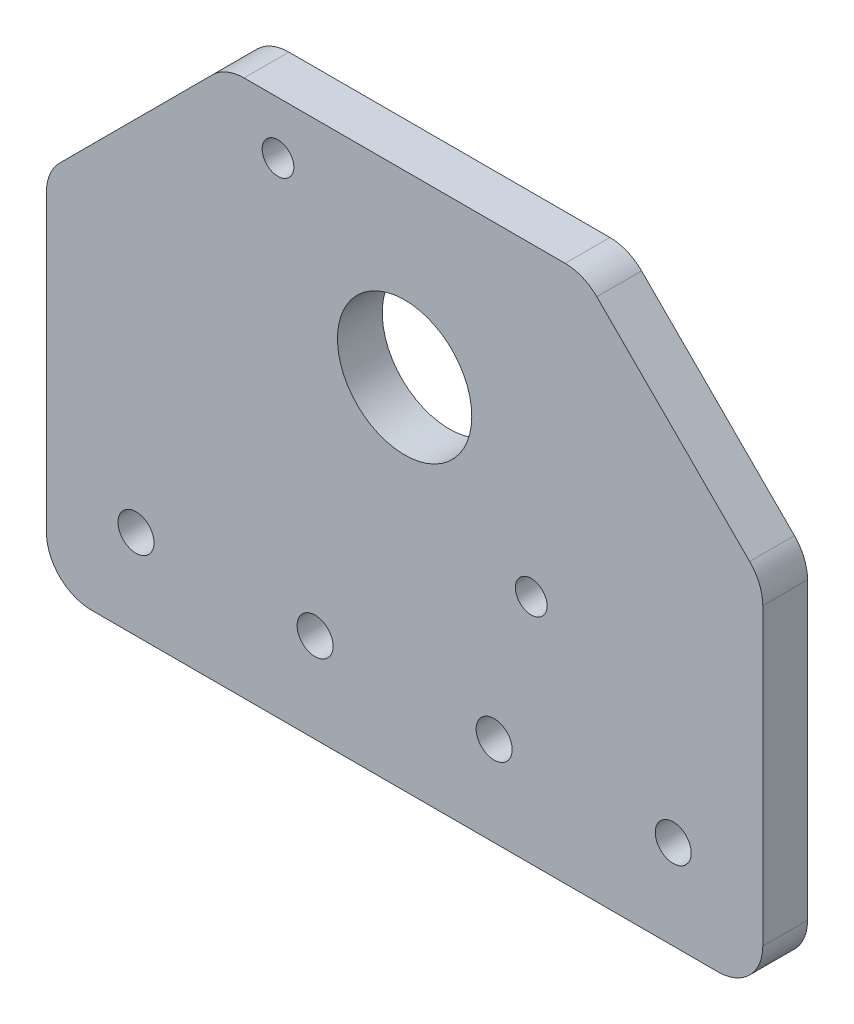
ISO-10303-21;
HEADER;
FILE_DESCRIPTION(('STEP AP214'),'2;1');
FILE_NAME('part.step','',(''),(''),'','','');
FILE_SCHEMA(('AUTOMOTIVE_DESIGN { 1 0 10303 214 1 1 1 1 }'));
ENDSEC;
DATA;
#1=APPLICATION_CONTEXT('core data for automotive mechanical design processes');
#2=APPLICATION_PROTOCOL_DEFINITION('international standard','automotive_design',2000,#1);
#3=PRODUCT_CONTEXT('',#1,'mechanical');
#4=PRODUCT('Part','Part','',(#3));
#5=PRODUCT_RELATED_PRODUCT_CATEGORY('part','',(#4));
#6=PRODUCT_DEFINITION_FORMATION('','',#4);
#7=PRODUCT_DEFINITION_CONTEXT('part definition',#1,'design');
#8=PRODUCT_DEFINITION('design','',#6,#7);
#9=PRODUCT_DEFINITION_SHAPE('','',#8);
#10=(LENGTH_UNIT() NAMED_UNIT(*) SI_UNIT(.MILLI.,.METRE.));
#11=(NAMED_UNIT(*) PLANE_ANGLE_UNIT() SI_UNIT($,.RADIAN.));
#12=(NAMED_UNIT(*) SI_UNIT($,.STERADIAN.) SOLID_ANGLE_UNIT());
#13=UNCERTAINTY_MEASURE_WITH_UNIT(LENGTH_MEASURE(1.E-05),#10,'distance_accuracy_value','');
#14=(GEOMETRIC_REPRESENTATION_CONTEXT(3) GLOBAL_UNCERTAINTY_ASSIGNED_CONTEXT((#13)) GLOBAL_UNIT_ASSIGNED_CONTEXT((#10,
#11,#12)) REPRESENTATION_CONTEXT('',''));
#15=CARTESIAN_POINT('',(0.,0.,0.));
#16=DIRECTION('',(0.,0.,1.));
#17=DIRECTION('',(1.,0.,0.));
#18=AXIS2_PLACEMENT_3D('',#15,#16,#17);
#19=CARTESIAN_POINT('',(0.,0.,3.175));
#20=DIRECTION('',(0.,0.,1.));
#21=DIRECTION('',(1.,0.,0.));
#22=AXIS2_PLACEMENT_3D('',#19,#20,#21);
#23=PLANE('',#22);
#24=CARTESIAN_POINT('',(-38.1,-38.1,3.175));
#25=DIRECTION('',(0.,0.,1.));
#26=DIRECTION('',(1.,0.,0.));
#27=AXIS2_PLACEMENT_3D('',#24,#25,#26);
#28=CIRCLE('',#27,2.5527);
#29=CARTESIAN_POINT('',(-35.5473,-38.1,3.175));
#30=VERTEX_POINT('',#29);
#31=EDGE_CURVE('E279',#30,#30,#28,.T.);
#32=ORIENTED_EDGE('',*,*,#31,.F.);
#33=EDGE_LOOP('',(#32));
#34=FACE_BOUND('',#33,.T.);
#35=CARTESIAN_POINT('',(-12.7,-38.1,3.175));
#36=DIRECTION('',(0.,0.,1.));
#37=DIRECTION('',(1.,0.,0.));
#38=AXIS2_PLACEMENT_3D('',#35,#36,#37);
#39=CIRCLE('',#38,2.5527);
#40=CARTESIAN_POINT('',(-10.1473,-38.1,3.175));
#41=VERTEX_POINT('',#40);
#42=EDGE_CURVE('E273',#41,#41,#39,.T.);
#43=ORIENTED_EDGE('',*,*,#42,.F.);
#44=EDGE_LOOP('',(#43));
#45=FACE_BOUND('',#44,.T.);
#46=CARTESIAN_POINT('',(12.7,-38.1,3.175));
#47=DIRECTION('',(0.,0.,1.));
#48=DIRECTION('',(1.,0.,0.));
#49=AXIS2_PLACEMENT_3D('',#46,#47,#48);
#50=CIRCLE('',#49,2.5527);
#51=CARTESIAN_POINT('',(15.2527,-38.1,3.175));
#52=VERTEX_POINT('',#51);
#53=EDGE_CURVE('E267',#52,#52,#50,.T.);
#54=ORIENTED_EDGE('',*,*,#53,.F.);
#55=EDGE_LOOP('',(#54));
#56=FACE_BOUND('',#55,.T.);
#57=CARTESIAN_POINT('',(38.1,-38.1,3.175));
#58=DIRECTION('',(0.,0.,1.));
#59=DIRECTION('',(1.,0.,0.));
#60=AXIS2_PLACEMENT_3D('',#57,#58,#59);
#61=CIRCLE('',#60,2.5527);
#62=CARTESIAN_POINT('',(40.6527,-38.1,3.175));
#63=VERTEX_POINT('',#62);
#64=EDGE_CURVE('E261',#63,#63,#61,.T.);
#65=ORIENTED_EDGE('',*,*,#64,.F.);
#66=EDGE_LOOP('',(#65));
#67=FACE_BOUND('',#66,.T.);
#68=CARTESIAN_POINT('',(-17.9605122421383,17.9605122421383,3.175));
#69=DIRECTION('',(0.,0.,1.));
#70=DIRECTION('',(1.,0.,0.));
#71=AXIS2_PLACEMENT_3D('',#68,#69,#70);
#72=CIRCLE('',#71,2.2479);
#73=CARTESIAN_POINT('',(-15.7126122421383,17.9605122421383,3.175));
#74=VERTEX_POINT('',#73);
#75=EDGE_CURVE('E255',#74,#74,#72,.T.);
#76=ORIENTED_EDGE('',*,*,#75,.F.);
#77=EDGE_LOOP('',(#76));
#78=FACE_BOUND('',#77,.T.);
#79=CARTESIAN_POINT('',(17.9605122421383,-17.9605122421383,3.175));
#80=DIRECTION('',(0.,0.,1.));
#81=DIRECTION('',(1.,0.,0.));
#82=AXIS2_PLACEMENT_3D('',#79,#80,#81);
#83=CIRCLE('',#82,2.2479);
#84=CARTESIAN_POINT('',(20.2084122421383,-17.9605122421383,3.175));
#85=VERTEX_POINT('',#84);
#86=EDGE_CURVE('E249',#85,#85,#83,.T.);
#87=ORIENTED_EDGE('',*,*,#86,.F.);
#88=EDGE_LOOP('',(#87));
#89=FACE_BOUND('',#88,.T.);
#90=DIRECTION('',(1.,0.,0.));
#91=VECTOR('',#90,1.);
#92=CARTESIAN_POINT('',(-50.8,-50.8,3.175));
#93=LINE('',#92,#91);
#94=CARTESIAN_POINT('',(-44.45,-50.8,3.175));
#95=VERTEX_POINT('',#94);
#96=CARTESIAN_POINT('',(44.45,-50.8,3.175));
#97=VERTEX_POINT('',#96);
#98=EDGE_CURVE('E165',#95,#97,#93,.T.);
#99=ORIENTED_EDGE('',*,*,#98,.T.);
#100=CARTESIAN_POINT('',(44.45,-44.45,3.175));
#101=DIRECTION('',(0.,0.,1.));
#102=DIRECTION('',(1.,0.,0.));
#103=AXIS2_PLACEMENT_3D('',#100,#101,#102);
#104=CIRCLE('',#103,6.35);
#105=CARTESIAN_POINT('',(50.8,-44.45,3.175));
#106=VERTEX_POINT('',#105);
#107=EDGE_CURVE('E201',#97,#106,#104,.T.);
#108=ORIENTED_EDGE('',*,*,#107,.T.);
#109=DIRECTION('',(0.,1.,0.));
#110=VECTOR('',#109,1.);
#111=CARTESIAN_POINT('',(50.8,-50.8,3.175));
#112=LINE('',#111,#110);
#113=CARTESIAN_POINT('',(50.8,-2.63025612106922,3.175));
#114=VERTEX_POINT('',#113);
#115=EDGE_CURVE('E146',#106,#114,#112,.T.);
#116=ORIENTED_EDGE('',*,*,#115,.T.);
#117=CARTESIAN_POINT('',(44.45,-2.63025612106921,3.175));
#118=DIRECTION('',(0.,0.,1.));
#119=DIRECTION('',(1.,0.,0.));
#120=AXIS2_PLACEMENT_3D('',#117,#118,#119);
#121=CIRCLE('',#120,6.35);
#122=CARTESIAN_POINT('',(48.9401280605346,1.85987193946536,3.175));
#123=VERTEX_POINT('',#122);
#124=EDGE_CURVE('E194',#114,#123,#121,.T.);
#125=ORIENTED_EDGE('',*,*,#124,.T.);
#126=DIRECTION('',(0.707106781186546,-0.707106781186549,0.));
#127=VECTOR('',#126,1.);
#128=CARTESIAN_POINT('',(25.4000000000001,25.4,3.175));
#129=LINE('',#128,#127);
#130=CARTESIAN_POINT('',(27.2598719394654,23.5401280605346,3.175));
#131=VERTEX_POINT('',#130);
#132=EDGE_CURVE('E178',#123,#131,#129,.F.);
#133=ORIENTED_EDGE('',*,*,#132,.T.);
#134=CARTESIAN_POINT('',(22.7697438789309,19.05,3.175));
#135=DIRECTION('',(0.,0.,1.));
#136=DIRECTION('',(1.,0.,0.));
#137=AXIS2_PLACEMENT_3D('',#134,#135,#136);
#138=CIRCLE('',#137,6.35);
#139=CARTESIAN_POINT('',(22.7697438789309,25.4,3.175));
#140=VERTEX_POINT('',#139);
#141=EDGE_CURVE('E192',#131,#140,#138,.T.);
#142=ORIENTED_EDGE('',*,*,#141,.T.);
#143=DIRECTION('',(-1.,0.,0.));
#144=VECTOR('',#143,1.);
#145=CARTESIAN_POINT('',(50.8,25.4,3.175));
#146=LINE('',#145,#144);
#147=CARTESIAN_POINT('',(-22.7697438789308,25.4,3.175));
#148=VERTEX_POINT('',#147);
#149=EDGE_CURVE('E233',#140,#148,#146,.T.);
#150=ORIENTED_EDGE('',*,*,#149,.T.);
#151=CARTESIAN_POINT('',(-22.7697438789308,19.05,3.175));
#152=DIRECTION('',(0.,0.,1.));
#153=DIRECTION('',(1.,0.,0.));
#154=AXIS2_PLACEMENT_3D('',#151,#152,#153);
#155=CIRCLE('',#154,6.35);
#156=CARTESIAN_POINT('',(-27.2598719394654,23.5401280605346,3.175));
#157=VERTEX_POINT('',#156);
#158=EDGE_CURVE('E196',#148,#157,#155,.T.);
#159=ORIENTED_EDGE('',*,*,#158,.T.);
#160=DIRECTION('',(0.707106781186549,0.707106781186546,0.));
#161=VECTOR('',#160,1.);
#162=CARTESIAN_POINT('',(-25.3999999999999,25.4,3.175));
#163=LINE('',#162,#161);
#164=CARTESIAN_POINT('',(-48.9401280605346,1.85987193946545,3.175));
#165=VERTEX_POINT('',#164);
#166=EDGE_CURVE('E176',#157,#165,#163,.F.);
#167=ORIENTED_EDGE('',*,*,#166,.T.);
#168=CARTESIAN_POINT('',(-44.45,-2.63025612106914,3.175));
#169=DIRECTION('',(0.,0.,1.));
#170=DIRECTION('',(1.,0.,0.));
#171=AXIS2_PLACEMENT_3D('',#168,#169,#170);
#172=CIRCLE('',#171,6.35);
#173=CARTESIAN_POINT('',(-50.8,-2.63025612106914,3.175));
#174=VERTEX_POINT('',#173);
#175=EDGE_CURVE('E57',#165,#174,#172,.T.);
#176=ORIENTED_EDGE('',*,*,#175,.T.);
#177=DIRECTION('',(0.,-1.,0.));
#178=VECTOR('',#177,1.);
#179=CARTESIAN_POINT('',(-50.8,25.4,3.175));
#180=LINE('',#179,#178);
#181=CARTESIAN_POINT('',(-50.8,-44.45,3.175));
#182=VERTEX_POINT('',#181);
#183=EDGE_CURVE('E240',#174,#182,#180,.T.);
#184=ORIENTED_EDGE('',*,*,#183,.T.);
#185=CARTESIAN_POINT('',(-44.45,-44.45,3.175));
#186=DIRECTION('',(0.,0.,1.));
#187=DIRECTION('',(1.,0.,0.));
#188=AXIS2_PLACEMENT_3D('',#185,#186,#187);
#189=CIRCLE('',#188,6.35);
#190=EDGE_CURVE('E199',#182,#95,#189,.T.);
#191=ORIENTED_EDGE('',*,*,#190,.T.);
#192=EDGE_LOOP('',(#99,#108,#116,#125,#133,#142,#150,#159,#167,#176,#184,#191));
#193=FACE_BOUND('',#192,.T.);
#194=CARTESIAN_POINT('',(0.,0.,3.175));
#195=DIRECTION('',(0.,0.,1.));
#196=DIRECTION('',(1.,0.,0.));
#197=AXIS2_PLACEMENT_3D('',#194,#195,#196);
#198=CIRCLE('',#197,9.525);
#199=CARTESIAN_POINT('',(9.525,0.,3.175));
#200=VERTEX_POINT('',#199);
#201=EDGE_CURVE('E156',#200,#200,#198,.T.);
#202=ORIENTED_EDGE('',*,*,#201,.F.);
#203=EDGE_LOOP('',(#202));
#204=FACE_BOUND('',#203,.T.);
#205=ADVANCED_FACE('F35',(#34,#45,#56,#67,#78,#89,#193,#204),#23,.T.);
#206=CARTESIAN_POINT('',(0.,0.,-3.175));
#207=DIRECTION('',(0.,0.,1.));
#208=DIRECTION('',(1.,0.,0.));
#209=AXIS2_PLACEMENT_3D('',#206,#207,#208);
#210=PLANE('',#209);
#211=CARTESIAN_POINT('',(-38.1,-38.1,-3.175));
#212=DIRECTION('',(0.,0.,1.));
#213=DIRECTION('',(1.,0.,0.));
#214=AXIS2_PLACEMENT_3D('',#211,#212,#213);
#215=CIRCLE('',#214,2.5527);
#216=CARTESIAN_POINT('',(-35.5473,-38.1,-3.175));
#217=VERTEX_POINT('',#216);
#218=EDGE_CURVE('E276',#217,#217,#215,.T.);
#219=ORIENTED_EDGE('',*,*,#218,.T.);
#220=EDGE_LOOP('',(#219));
#221=FACE_BOUND('',#220,.T.);
#222=CARTESIAN_POINT('',(-12.7,-38.1,-3.175));
#223=DIRECTION('',(0.,0.,1.));
#224=DIRECTION('',(1.,0.,0.));
#225=AXIS2_PLACEMENT_3D('',#222,#223,#224);
#226=CIRCLE('',#225,2.5527);
#227=CARTESIAN_POINT('',(-10.1473,-38.1,-3.175));
#228=VERTEX_POINT('',#227);
#229=EDGE_CURVE('E270',#228,#228,#226,.T.);
#230=ORIENTED_EDGE('',*,*,#229,.T.);
#231=EDGE_LOOP('',(#230));
#232=FACE_BOUND('',#231,.T.);
#233=CARTESIAN_POINT('',(12.7,-38.1,-3.175));
#234=DIRECTION('',(0.,0.,1.));
#235=DIRECTION('',(1.,0.,0.));
#236=AXIS2_PLACEMENT_3D('',#233,#234,#235);
#237=CIRCLE('',#236,2.5527);
#238=CARTESIAN_POINT('',(15.2527,-38.1,-3.175));
#239=VERTEX_POINT('',#238);
#240=EDGE_CURVE('E264',#239,#239,#237,.T.);
#241=ORIENTED_EDGE('',*,*,#240,.T.);
#242=EDGE_LOOP('',(#241));
#243=FACE_BOUND('',#242,.T.);
#244=CARTESIAN_POINT('',(38.1,-38.1,-3.175));
#245=DIRECTION('',(0.,0.,1.));
#246=DIRECTION('',(1.,0.,0.));
#247=AXIS2_PLACEMENT_3D('',#244,#245,#246);
#248=CIRCLE('',#247,2.5527);
#249=CARTESIAN_POINT('',(40.6527,-38.1,-3.175));
#250=VERTEX_POINT('',#249);
#251=EDGE_CURVE('E258',#250,#250,#248,.T.);
#252=ORIENTED_EDGE('',*,*,#251,.T.);
#253=EDGE_LOOP('',(#252));
#254=FACE_BOUND('',#253,.T.);
#255=CARTESIAN_POINT('',(-17.9605122421383,17.9605122421383,-3.175));
#256=DIRECTION('',(0.,0.,1.));
#257=DIRECTION('',(1.,0.,0.));
#258=AXIS2_PLACEMENT_3D('',#255,#256,#257);
#259=CIRCLE('',#258,2.2479);
#260=CARTESIAN_POINT('',(-15.7126122421383,17.9605122421383,-3.175));
#261=VERTEX_POINT('',#260);
#262=EDGE_CURVE('E252',#261,#261,#259,.T.);
#263=ORIENTED_EDGE('',*,*,#262,.T.);
#264=EDGE_LOOP('',(#263));
#265=FACE_BOUND('',#264,.T.);
#266=CARTESIAN_POINT('',(17.9605122421383,-17.9605122421383,-3.175));
#267=DIRECTION('',(0.,0.,1.));
#268=DIRECTION('',(1.,0.,0.));
#269=AXIS2_PLACEMENT_3D('',#266,#267,#268);
#270=CIRCLE('',#269,2.2479);
#271=CARTESIAN_POINT('',(20.2084122421383,-17.9605122421383,-3.175));
#272=VERTEX_POINT('',#271);
#273=EDGE_CURVE('E245',#272,#272,#270,.T.);
#274=ORIENTED_EDGE('',*,*,#273,.T.);
#275=EDGE_LOOP('',(#274));
#276=FACE_BOUND('',#275,.T.);
#277=DIRECTION('',(0.,1.,0.));
#278=VECTOR('',#277,1.);
#279=CARTESIAN_POINT('',(50.8,-50.8,-3.175));
#280=LINE('',#279,#278);
#281=CARTESIAN_POINT('',(50.8,-44.45,-3.175));
#282=VERTEX_POINT('',#281);
#283=CARTESIAN_POINT('',(50.8,-2.63025612106922,-3.175));
#284=VERTEX_POINT('',#283);
#285=EDGE_CURVE('E143',#282,#284,#280,.T.);
#286=ORIENTED_EDGE('',*,*,#285,.F.);
#287=CARTESIAN_POINT('',(44.45,-44.45,-3.175));
#288=DIRECTION('',(0.,0.,1.));
#289=DIRECTION('',(1.,0.,0.));
#290=AXIS2_PLACEMENT_3D('',#287,#288,#289);
#291=CIRCLE('',#290,6.35);
#292=CARTESIAN_POINT('',(44.45,-50.8,-3.175));
#293=VERTEX_POINT('',#292);
#294=EDGE_CURVE('E125',#282,#293,#291,.F.);
#295=ORIENTED_EDGE('',*,*,#294,.T.);
#296=DIRECTION('',(1.,0.,0.));
#297=VECTOR('',#296,1.);
#298=CARTESIAN_POINT('',(-50.8,-50.8,-3.175));
#299=LINE('',#298,#297);
#300=CARTESIAN_POINT('',(-44.45,-50.8,-3.175));
#301=VERTEX_POINT('',#300);
#302=EDGE_CURVE('E169',#301,#293,#299,.T.);
#303=ORIENTED_EDGE('',*,*,#302,.F.);
#304=CARTESIAN_POINT('',(-44.45,-44.45,-3.175));
#305=DIRECTION('',(0.,0.,1.));
#306=DIRECTION('',(1.,0.,0.));
#307=AXIS2_PLACEMENT_3D('',#304,#305,#306);
#308=CIRCLE('',#307,6.35);
#309=CARTESIAN_POINT('',(-50.8,-44.45,-3.175));
#310=VERTEX_POINT('',#309);
#311=EDGE_CURVE('E136',#301,#310,#308,.F.);
#312=ORIENTED_EDGE('',*,*,#311,.T.);
#313=DIRECTION('',(0.,-1.,0.));
#314=VECTOR('',#313,1.);
#315=CARTESIAN_POINT('',(-50.8,25.4,-3.175));
#316=LINE('',#315,#314);
#317=CARTESIAN_POINT('',(-50.8,-2.63025612106914,-3.175));
#318=VERTEX_POINT('',#317);
#319=EDGE_CURVE('E159',#318,#310,#316,.T.);
#320=ORIENTED_EDGE('',*,*,#319,.F.);
#321=CARTESIAN_POINT('',(-44.45,-2.63025612106914,-3.175));
#322=DIRECTION('',(0.,0.,1.));
#323=DIRECTION('',(1.,0.,0.));
#324=AXIS2_PLACEMENT_3D('',#321,#322,#323);
#325=CIRCLE('',#324,6.35);
#326=CARTESIAN_POINT('',(-48.9401280605346,1.85987193946545,-3.175));
#327=VERTEX_POINT('',#326);
#328=EDGE_CURVE('E186',#318,#327,#325,.F.);
#329=ORIENTED_EDGE('',*,*,#328,.T.);
#330=DIRECTION('',(-0.707106781186549,-0.707106781186546,0.));
#331=VECTOR('',#330,1.);
#332=CARTESIAN_POINT('',(-50.8,0.,-3.175));
#333=LINE('',#332,#331);
#334=CARTESIAN_POINT('',(-27.2598719394654,23.5401280605346,-3.175));
#335=VERTEX_POINT('',#334);
#336=EDGE_CURVE('E171',#327,#335,#333,.F.);
#337=ORIENTED_EDGE('',*,*,#336,.T.);
#338=CARTESIAN_POINT('',(-22.7697438789308,19.05,-3.175));
#339=DIRECTION('',(0.,0.,1.));
#340=DIRECTION('',(1.,0.,0.));
#341=AXIS2_PLACEMENT_3D('',#338,#339,#340);
#342=CIRCLE('',#341,6.35);
#343=CARTESIAN_POINT('',(-22.7697438789308,25.4,-3.175));
#344=VERTEX_POINT('',#343);
#345=EDGE_CURVE('E184',#335,#344,#342,.F.);
#346=ORIENTED_EDGE('',*,*,#345,.T.);
#347=DIRECTION('',(-1.,0.,0.));
#348=VECTOR('',#347,1.);
#349=CARTESIAN_POINT('',(50.8,25.4,-3.175));
#350=LINE('',#349,#348);
#351=CARTESIAN_POINT('',(22.7697438789309,25.4,-3.175));
#352=VERTEX_POINT('',#351);
#353=EDGE_CURVE('E155',#352,#344,#350,.T.);
#354=ORIENTED_EDGE('',*,*,#353,.F.);
#355=CARTESIAN_POINT('',(22.7697438789309,19.05,-3.175));
#356=DIRECTION('',(0.,0.,1.));
#357=DIRECTION('',(1.,0.,0.));
#358=AXIS2_PLACEMENT_3D('',#355,#356,#357);
#359=CIRCLE('',#358,6.35);
#360=CARTESIAN_POINT('',(27.2598719394654,23.5401280605346,-3.175));
#361=VERTEX_POINT('',#360);
#362=EDGE_CURVE('E147',#352,#361,#359,.F.);
#363=ORIENTED_EDGE('',*,*,#362,.T.);
#364=DIRECTION('',(-0.707106781186546,0.707106781186549,0.));
#365=VECTOR('',#364,1.);
#366=CARTESIAN_POINT('',(25.4,25.4,-3.175));
#367=LINE('',#366,#365);
#368=CARTESIAN_POINT('',(48.9401280605346,1.85987193946536,-3.175));
#369=VERTEX_POINT('',#368);
#370=EDGE_CURVE('E174',#361,#369,#367,.F.);
#371=ORIENTED_EDGE('',*,*,#370,.T.);
#372=CARTESIAN_POINT('',(44.45,-2.63025612106921,-3.175));
#373=DIRECTION('',(0.,0.,1.));
#374=DIRECTION('',(1.,0.,0.));
#375=AXIS2_PLACEMENT_3D('',#372,#373,#374);
#376=CIRCLE('',#375,6.35);
#377=EDGE_CURVE('E154',#369,#284,#376,.F.);
#378=ORIENTED_EDGE('',*,*,#377,.T.);
#379=EDGE_LOOP('',(#286,#295,#303,#312,#320,#329,#337,#346,#354,#363,#371,#378));
#380=FACE_BOUND('',#379,.T.);
#381=CARTESIAN_POINT('',(0.,0.,-3.175));
#382=DIRECTION('',(0.,0.,1.));
#383=DIRECTION('',(1.,0.,0.));
#384=AXIS2_PLACEMENT_3D('',#381,#382,#383);
#385=CIRCLE('',#384,9.525);
#386=CARTESIAN_POINT('',(9.525,0.,-3.175));
#387=VERTEX_POINT('',#386);
#388=EDGE_CURVE('E162',#387,#387,#385,.T.);
#389=ORIENTED_EDGE('',*,*,#388,.T.);
#390=EDGE_LOOP('',(#389));
#391=FACE_BOUND('',#390,.T.);
#392=ADVANCED_FACE('F150',(#221,#232,#243,#254,#265,#276,#380,#391),#210,.F.);
#393=CARTESIAN_POINT('',(50.8,-50.8,3.175));
#394=DIRECTION('',(-1.,0.,0.));
#395=DIRECTION('',(0.,0.,1.));
#396=AXIS2_PLACEMENT_3D('',#393,#394,#395);
#397=PLANE('',#396);
#398=ORIENTED_EDGE('',*,*,#115,.F.);
#399=DIRECTION('',(0.,0.,-1.));
#400=VECTOR('',#399,1.);
#401=CARTESIAN_POINT('',(50.8,-44.45,3.175));
#402=LINE('',#401,#400);
#403=EDGE_CURVE('E129',#106,#282,#402,.T.);
#404=ORIENTED_EDGE('',*,*,#403,.T.);
#405=ORIENTED_EDGE('',*,*,#285,.T.);
#406=DIRECTION('',(0.,0.,-1.));
#407=VECTOR('',#406,1.);
#408=CARTESIAN_POINT('',(50.8,-2.63025612106921,3.175));
#409=LINE('',#408,#407);
#410=EDGE_CURVE('E148',#284,#114,#409,.F.);
#411=ORIENTED_EDGE('',*,*,#410,.T.);
#412=EDGE_LOOP('',(#398,#404,#405,#411));
#413=FACE_BOUND('',#412,.T.);
#414=ADVANCED_FACE('F141',(#413),#397,.F.);
#415=CARTESIAN_POINT('',(50.8,25.4,3.175));
#416=DIRECTION('',(0.,-1.,0.));
#417=DIRECTION('',(1.,0.,0.));
#418=AXIS2_PLACEMENT_3D('',#415,#416,#417);
#419=PLANE('',#418);
#420=ORIENTED_EDGE('',*,*,#353,.T.);
#421=DIRECTION('',(0.,0.,-1.));
#422=VECTOR('',#421,1.);
#423=CARTESIAN_POINT('',(-22.7697438789308,25.4,3.175));
#424=LINE('',#423,#422);
#425=EDGE_CURVE('E214',#344,#148,#424,.F.);
#426=ORIENTED_EDGE('',*,*,#425,.T.);
#427=ORIENTED_EDGE('',*,*,#149,.F.);
#428=DIRECTION('',(0.,0.,1.));
#429=VECTOR('',#428,1.);
#430=CARTESIAN_POINT('',(22.7697438789309,25.4,-3.175));
#431=LINE('',#430,#429);
#432=EDGE_CURVE('E211',#140,#352,#431,.F.);
#433=ORIENTED_EDGE('',*,*,#432,.T.);
#434=EDGE_LOOP('',(#420,#426,#427,#433));
#435=FACE_BOUND('',#434,.T.);
#436=ADVANCED_FACE('F231',(#435),#419,.F.);
#437=CARTESIAN_POINT('',(-50.8,25.4,3.175));
#438=DIRECTION('',(1.,0.,0.));
#439=DIRECTION('',(0.,0.,-1.));
#440=AXIS2_PLACEMENT_3D('',#437,#438,#439);
#441=PLANE('',#440);
#442=ORIENTED_EDGE('',*,*,#319,.T.);
#443=DIRECTION('',(0.,0.,-1.));
#444=VECTOR('',#443,1.);
#445=CARTESIAN_POINT('',(-50.8,-44.45,3.175));
#446=LINE('',#445,#444);
#447=EDGE_CURVE('E50',#310,#182,#446,.F.);
#448=ORIENTED_EDGE('',*,*,#447,.T.);
#449=ORIENTED_EDGE('',*,*,#183,.F.);
#450=DIRECTION('',(0.,0.,1.));
#451=VECTOR('',#450,1.);
#452=CARTESIAN_POINT('',(-50.8,-2.63025612106914,-3.175));
#453=LINE('',#452,#451);
#454=EDGE_CURVE('E203',#174,#318,#453,.F.);
#455=ORIENTED_EDGE('',*,*,#454,.T.);
#456=EDGE_LOOP('',(#442,#448,#449,#455));
#457=FACE_BOUND('',#456,.T.);
#458=ADVANCED_FACE('F321',(#457),#441,.F.);
#459=CARTESIAN_POINT('',(-50.8,-50.8,3.175));
#460=DIRECTION('',(0.,1.,0.));
#461=DIRECTION('',(-1.,0.,0.));
#462=AXIS2_PLACEMENT_3D('',#459,#460,#461);
#463=PLANE('',#462);
#464=ORIENTED_EDGE('',*,*,#302,.T.);
#465=DIRECTION('',(0.,0.,-1.));
#466=VECTOR('',#465,1.);
#467=CARTESIAN_POINT('',(44.45,-50.8,3.175));
#468=LINE('',#467,#466);
#469=EDGE_CURVE('E130',#293,#97,#468,.F.);
#470=ORIENTED_EDGE('',*,*,#469,.T.);
#471=ORIENTED_EDGE('',*,*,#98,.F.);
#472=DIRECTION('',(0.,0.,-1.));
#473=VECTOR('',#472,1.);
#474=CARTESIAN_POINT('',(-44.45,-50.8,3.175));
#475=LINE('',#474,#473);
#476=EDGE_CURVE('E135',#95,#301,#475,.T.);
#477=ORIENTED_EDGE('',*,*,#476,.T.);
#478=EDGE_LOOP('',(#464,#470,#471,#477));
#479=FACE_BOUND('',#478,.T.);
#480=ADVANCED_FACE('F310',(#479),#463,.F.);
#481=CARTESIAN_POINT('',(0.,0.,3.175));
#482=DIRECTION('',(0.,0.,-1.));
#483=DIRECTION('',(-1.,0.,0.));
#484=AXIS2_PLACEMENT_3D('',#481,#482,#483);
#485=CYLINDRICAL_SURFACE('',#484,9.525);
#486=ORIENTED_EDGE('',*,*,#201,.T.);
#487=EDGE_LOOP('',(#486));
#488=FACE_BOUND('',#487,.T.);
#489=ORIENTED_EDGE('',*,*,#388,.F.);
#490=EDGE_LOOP('',(#489));
#491=FACE_BOUND('',#490,.T.);
#492=ADVANCED_FACE('F301',(#488,#491),#485,.F.);
#493=CARTESIAN_POINT('',(17.9605122421383,-17.9605122421383,3.175));
#494=DIRECTION('',(0.,0.,1.));
#495=DIRECTION('',(1.,0.,0.));
#496=AXIS2_PLACEMENT_3D('',#493,#494,#495);
#497=CYLINDRICAL_SURFACE('',#496,2.2479);
#498=ORIENTED_EDGE('',*,*,#273,.F.);
#499=EDGE_LOOP('',(#498));
#500=FACE_BOUND('',#499,.T.);
#501=ORIENTED_EDGE('',*,*,#86,.T.);
#502=EDGE_LOOP('',(#501));
#503=FACE_BOUND('',#502,.T.);
#504=ADVANCED_FACE('F298',(#500,#503),#497,.F.);
#505=CARTESIAN_POINT('',(-17.9605122421383,17.9605122421383,3.175));
#506=DIRECTION('',(0.,0.,1.));
#507=DIRECTION('',(1.,0.,0.));
#508=AXIS2_PLACEMENT_3D('',#505,#506,#507);
#509=CYLINDRICAL_SURFACE('',#508,2.2479);
#510=ORIENTED_EDGE('',*,*,#262,.F.);
#511=EDGE_LOOP('',(#510));
#512=FACE_BOUND('',#511,.T.);
#513=ORIENTED_EDGE('',*,*,#75,.T.);
#514=EDGE_LOOP('',(#513));
#515=FACE_BOUND('',#514,.T.);
#516=ADVANCED_FACE('F300',(#512,#515),#509,.F.);
#517=CARTESIAN_POINT('',(25.4,25.4,3.175));
#518=DIRECTION('',(-0.707106781186549,-0.707106781186546,0.));
#519=DIRECTION('',(0.,0.,-1.));
#520=AXIS2_PLACEMENT_3D('',#517,#518,#519);
#521=PLANE('',#520);
#522=ORIENTED_EDGE('',*,*,#132,.F.);
#523=DIRECTION('',(0.,0.,1.));
#524=VECTOR('',#523,1.);
#525=CARTESIAN_POINT('',(48.9401280605346,1.85987193946536,-3.175));
#526=LINE('',#525,#524);
#527=EDGE_CURVE('E11',#123,#369,#526,.F.);
#528=ORIENTED_EDGE('',*,*,#527,.T.);
#529=ORIENTED_EDGE('',*,*,#370,.F.);
#530=DIRECTION('',(0.,0.,-1.));
#531=VECTOR('',#530,1.);
#532=CARTESIAN_POINT('',(27.2598719394654,23.5401280605346,3.175));
#533=LINE('',#532,#531);
#534=EDGE_CURVE('E43',#361,#131,#533,.F.);
#535=ORIENTED_EDGE('',*,*,#534,.T.);
#536=EDGE_LOOP('',(#522,#528,#529,#535));
#537=FACE_BOUND('',#536,.T.);
#538=ADVANCED_FACE('F220',(#537),#521,.F.);
#539=CARTESIAN_POINT('',(-50.8,0.,3.175));
#540=DIRECTION('',(0.707106781186546,-0.707106781186549,0.));
#541=DIRECTION('',(0.,0.,-1.));
#542=AXIS2_PLACEMENT_3D('',#539,#540,#541);
#543=PLANE('',#542);
#544=ORIENTED_EDGE('',*,*,#336,.F.);
#545=DIRECTION('',(0.,0.,-1.));
#546=VECTOR('',#545,1.);
#547=CARTESIAN_POINT('',(-48.9401280605346,1.85987193946545,3.175));
#548=LINE('',#547,#546);
#549=EDGE_CURVE('E209',#327,#165,#548,.F.);
#550=ORIENTED_EDGE('',*,*,#549,.T.);
#551=ORIENTED_EDGE('',*,*,#166,.F.);
#552=DIRECTION('',(0.,0.,1.));
#553=VECTOR('',#552,1.);
#554=CARTESIAN_POINT('',(-27.2598719394654,23.5401280605346,-3.175));
#555=LINE('',#554,#553);
#556=EDGE_CURVE('E207',#157,#335,#555,.F.);
#557=ORIENTED_EDGE('',*,*,#556,.T.);
#558=EDGE_LOOP('',(#544,#550,#551,#557));
#559=FACE_BOUND('',#558,.T.);
#560=ADVANCED_FACE('F331',(#559),#543,.F.);
#561=CARTESIAN_POINT('',(38.1,-38.1,3.175));
#562=DIRECTION('',(0.,0.,1.));
#563=DIRECTION('',(1.,0.,0.));
#564=AXIS2_PLACEMENT_3D('',#561,#562,#563);
#565=CYLINDRICAL_SURFACE('',#564,2.5527);
#566=ORIENTED_EDGE('',*,*,#251,.F.);
#567=EDGE_LOOP('',(#566));
#568=FACE_BOUND('',#567,.T.);
#569=ORIENTED_EDGE('',*,*,#64,.T.);
#570=EDGE_LOOP('',(#569));
#571=FACE_BOUND('',#570,.T.);
#572=ADVANCED_FACE('F334',(#568,#571),#565,.F.);
#573=CARTESIAN_POINT('',(12.7,-38.1,3.175));
#574=DIRECTION('',(0.,0.,1.));
#575=DIRECTION('',(1.,0.,0.));
#576=AXIS2_PLACEMENT_3D('',#573,#574,#575);
#577=CYLINDRICAL_SURFACE('',#576,2.5527);
#578=ORIENTED_EDGE('',*,*,#240,.F.);
#579=EDGE_LOOP('',(#578));
#580=FACE_BOUND('',#579,.T.);
#581=ORIENTED_EDGE('',*,*,#53,.T.);
#582=EDGE_LOOP('',(#581));
#583=FACE_BOUND('',#582,.T.);
#584=ADVANCED_FACE('F460',(#580,#583),#577,.F.);
#585=CARTESIAN_POINT('',(-12.7,-38.1,3.175));
#586=DIRECTION('',(0.,0.,1.));
#587=DIRECTION('',(1.,0.,0.));
#588=AXIS2_PLACEMENT_3D('',#585,#586,#587);
#589=CYLINDRICAL_SURFACE('',#588,2.5527);
#590=ORIENTED_EDGE('',*,*,#229,.F.);
#591=EDGE_LOOP('',(#590));
#592=FACE_BOUND('',#591,.T.);
#593=ORIENTED_EDGE('',*,*,#42,.T.);
#594=EDGE_LOOP('',(#593));
#595=FACE_BOUND('',#594,.T.);
#596=ADVANCED_FACE('F450',(#592,#595),#589,.F.);
#597=CARTESIAN_POINT('',(-38.1,-38.1,3.175));
#598=DIRECTION('',(0.,0.,1.));
#599=DIRECTION('',(1.,0.,0.));
#600=AXIS2_PLACEMENT_3D('',#597,#598,#599);
#601=CYLINDRICAL_SURFACE('',#600,2.5527);
#602=ORIENTED_EDGE('',*,*,#218,.F.);
#603=EDGE_LOOP('',(#602));
#604=FACE_BOUND('',#603,.T.);
#605=ORIENTED_EDGE('',*,*,#31,.T.);
#606=EDGE_LOOP('',(#605));
#607=FACE_BOUND('',#606,.T.);
#608=ADVANCED_FACE('F283',(#604,#607),#601,.F.);
#609=CARTESIAN_POINT('',(44.45,-44.45,3.175));
#610=DIRECTION('',(0.,0.,-1.));
#611=DIRECTION('',(-1.,0.,0.));
#612=AXIS2_PLACEMENT_3D('',#609,#610,#611);
#613=CYLINDRICAL_SURFACE('',#612,6.35);
#614=ORIENTED_EDGE('',*,*,#107,.F.);
#615=ORIENTED_EDGE('',*,*,#469,.F.);
#616=ORIENTED_EDGE('',*,*,#294,.F.);
#617=ORIENTED_EDGE('',*,*,#403,.F.);
#618=EDGE_LOOP('',(#614,#615,#616,#617));
#619=FACE_BOUND('',#618,.T.);
#620=ADVANCED_FACE('F128',(#619),#613,.T.);
#621=CARTESIAN_POINT('',(-44.45,-44.45,3.175));
#622=DIRECTION('',(0.,0.,-1.));
#623=DIRECTION('',(-1.,0.,0.));
#624=AXIS2_PLACEMENT_3D('',#621,#622,#623);
#625=CYLINDRICAL_SURFACE('',#624,6.35);
#626=ORIENTED_EDGE('',*,*,#190,.F.);
#627=ORIENTED_EDGE('',*,*,#447,.F.);
#628=ORIENTED_EDGE('',*,*,#311,.F.);
#629=ORIENTED_EDGE('',*,*,#476,.F.);
#630=EDGE_LOOP('',(#626,#627,#628,#629));
#631=FACE_BOUND('',#630,.T.);
#632=ADVANCED_FACE('F338',(#631),#625,.T.);
#633=CARTESIAN_POINT('',(-44.45,-2.63025612106914,3.175));
#634=DIRECTION('',(0.,0.,-1.));
#635=DIRECTION('',(-1.,0.,0.));
#636=AXIS2_PLACEMENT_3D('',#633,#634,#635);
#637=CYLINDRICAL_SURFACE('',#636,6.35);
#638=ORIENTED_EDGE('',*,*,#175,.F.);
#639=ORIENTED_EDGE('',*,*,#549,.F.);
#640=ORIENTED_EDGE('',*,*,#328,.F.);
#641=ORIENTED_EDGE('',*,*,#454,.F.);
#642=EDGE_LOOP('',(#638,#639,#640,#641));
#643=FACE_BOUND('',#642,.T.);
#644=ADVANCED_FACE('F341',(#643),#637,.T.);
#645=CARTESIAN_POINT('',(-22.7697438789308,19.05,3.175));
#646=DIRECTION('',(0.,0.,1.));
#647=DIRECTION('',(1.,0.,0.));
#648=AXIS2_PLACEMENT_3D('',#645,#646,#647);
#649=CYLINDRICAL_SURFACE('',#648,6.35);
#650=ORIENTED_EDGE('',*,*,#345,.F.);
#651=ORIENTED_EDGE('',*,*,#556,.F.);
#652=ORIENTED_EDGE('',*,*,#158,.F.);
#653=ORIENTED_EDGE('',*,*,#425,.F.);
#654=EDGE_LOOP('',(#650,#651,#652,#653));
#655=FACE_BOUND('',#654,.T.);
#656=ADVANCED_FACE('F238',(#655),#649,.T.);
#657=CARTESIAN_POINT('',(44.45,-2.63025612106921,3.175));
#658=DIRECTION('',(0.,0.,1.));
#659=DIRECTION('',(1.,0.,0.));
#660=AXIS2_PLACEMENT_3D('',#657,#658,#659);
#661=CYLINDRICAL_SURFACE('',#660,6.35);
#662=ORIENTED_EDGE('',*,*,#377,.F.);
#663=ORIENTED_EDGE('',*,*,#527,.F.);
#664=ORIENTED_EDGE('',*,*,#124,.F.);
#665=ORIENTED_EDGE('',*,*,#410,.F.);
#666=EDGE_LOOP('',(#662,#663,#664,#665));
#667=FACE_BOUND('',#666,.T.);
#668=ADVANCED_FACE('F347',(#667),#661,.T.);
#669=CARTESIAN_POINT('',(22.7697438789309,19.05,3.175));
#670=DIRECTION('',(0.,0.,-1.));
#671=DIRECTION('',(-1.,0.,0.));
#672=AXIS2_PLACEMENT_3D('',#669,#670,#671);
#673=CYLINDRICAL_SURFACE('',#672,6.35);
#674=ORIENTED_EDGE('',*,*,#141,.F.);
#675=ORIENTED_EDGE('',*,*,#534,.F.);
#676=ORIENTED_EDGE('',*,*,#362,.F.);
#677=ORIENTED_EDGE('',*,*,#432,.F.);
#678=EDGE_LOOP('',(#674,#675,#676,#677));
#679=FACE_BOUND('',#678,.T.);
#680=ADVANCED_FACE('F37',(#679),#673,.T.);
#681=CLOSED_SHELL('',(#205,#392,#414,#436,#458,#480,#492,#504,#516,#538,#560,#572,#584,#596,
#608,#620,#632,#644,#656,#668,#680));
#682=MANIFOLD_SOLID_BREP('B2',#681);
#683=ADVANCED_BREP_SHAPE_REPRESENTATION('',(#18,#682),#14);
#684=SHAPE_DEFINITION_REPRESENTATION(#9,#683);
ENDSEC;
END-ISO-10303-21;
